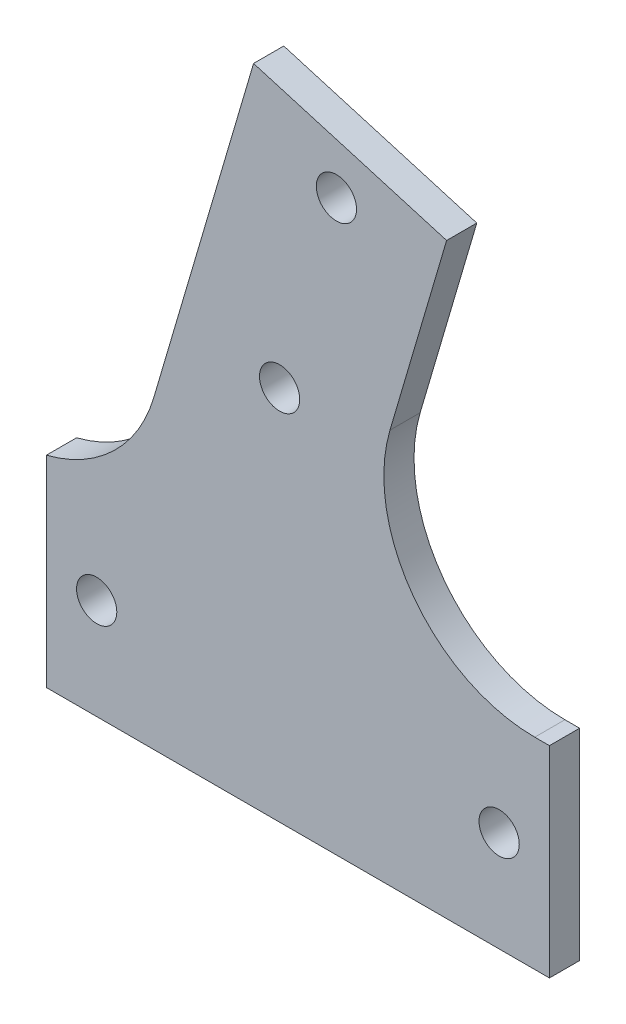
ISO-10303-21;
HEADER;
FILE_DESCRIPTION(('STEP AP214'),'2;1');
FILE_NAME('part.step','',(''),(''),'','','');
FILE_SCHEMA(('AUTOMOTIVE_DESIGN { 1 0 10303 214 1 1 1 1 }'));
ENDSEC;
DATA;
#1=APPLICATION_CONTEXT('core data for automotive mechanical design processes');
#2=APPLICATION_PROTOCOL_DEFINITION('international standard','automotive_design',2000,#1);
#3=PRODUCT_CONTEXT('',#1,'mechanical');
#4=PRODUCT('Part','Part','',(#3));
#5=PRODUCT_RELATED_PRODUCT_CATEGORY('part','',(#4));
#6=PRODUCT_DEFINITION_FORMATION('','',#4);
#7=PRODUCT_DEFINITION_CONTEXT('part definition',#1,'design');
#8=PRODUCT_DEFINITION('design','',#6,#7);
#9=PRODUCT_DEFINITION_SHAPE('','',#8);
#10=(LENGTH_UNIT() NAMED_UNIT(*) SI_UNIT(.MILLI.,.METRE.));
#11=(NAMED_UNIT(*) PLANE_ANGLE_UNIT() SI_UNIT($,.RADIAN.));
#12=(NAMED_UNIT(*) SI_UNIT($,.STERADIAN.) SOLID_ANGLE_UNIT());
#13=UNCERTAINTY_MEASURE_WITH_UNIT(LENGTH_MEASURE(1.E-05),#10,'distance_accuracy_value','');
#14=(GEOMETRIC_REPRESENTATION_CONTEXT(3) GLOBAL_UNCERTAINTY_ASSIGNED_CONTEXT((#13)) GLOBAL_UNIT_ASSIGNED_CONTEXT((#10,
#11,#12)) REPRESENTATION_CONTEXT('',''));
#15=CARTESIAN_POINT('',(0.,0.,0.));
#16=DIRECTION('',(0.,0.,1.));
#17=DIRECTION('',(1.,0.,0.));
#18=AXIS2_PLACEMENT_3D('',#15,#16,#17);
#19=CARTESIAN_POINT('',(-25.,10.,3.));
#20=DIRECTION('',(0.,-1.,0.));
#21=DIRECTION('',(1.,0.,0.));
#22=AXIS2_PLACEMENT_3D('',#19,#20,#21);
#23=PLANE('',#22);
#24=DIRECTION('',(-1.,0.,0.));
#25=VECTOR('',#24,1.);
#26=CARTESIAN_POINT('',(-25.,10.,0.));
#27=LINE('',#26,#25);
#28=CARTESIAN_POINT('',(25.,10.,0.));
#29=VERTEX_POINT('',#28);
#30=CARTESIAN_POINT('',(23.5412694196144,10.,0.));
#31=VERTEX_POINT('',#30);
#32=EDGE_CURVE('E172',#29,#31,#27,.T.);
#33=ORIENTED_EDGE('',*,*,#32,.T.);
#34=DIRECTION('',(0.,0.,-1.));
#35=VECTOR('',#34,1.);
#36=CARTESIAN_POINT('',(23.5412694196144,10.,3.));
#37=LINE('',#36,#35);
#38=CARTESIAN_POINT('',(23.5412694196144,10.,3.));
#39=VERTEX_POINT('',#38);
#40=EDGE_CURVE('E62',#31,#39,#37,.F.);
#41=ORIENTED_EDGE('',*,*,#40,.T.);
#42=DIRECTION('',(-1.,0.,0.));
#43=VECTOR('',#42,1.);
#44=CARTESIAN_POINT('',(-25.,10.,3.));
#45=LINE('',#44,#43);
#46=CARTESIAN_POINT('',(25.,10.,3.));
#47=VERTEX_POINT('',#46);
#48=EDGE_CURVE('E162',#47,#39,#45,.T.);
#49=ORIENTED_EDGE('',*,*,#48,.F.);
#50=DIRECTION('',(0.,0.,-1.));
#51=VECTOR('',#50,1.);
#52=CARTESIAN_POINT('',(25.,10.,3.));
#53=LINE('',#52,#51);
#54=EDGE_CURVE('E185',#47,#29,#53,.T.);
#55=ORIENTED_EDGE('',*,*,#54,.T.);
#56=EDGE_LOOP('',(#33,#41,#49,#55));
#57=FACE_BOUND('',#56,.T.);
#58=ADVANCED_FACE('F41',(#57),#23,.F.);
#59=CARTESIAN_POINT('',(0.,0.,3.));
#60=DIRECTION('',(0.,0.,1.));
#61=DIRECTION('',(1.,0.,0.));
#62=AXIS2_PLACEMENT_3D('',#59,#60,#61);
#63=PLANE('',#62);
#64=CARTESIAN_POINT('',(20.,0.,3.));
#65=DIRECTION('',(0.,0.,1.));
#66=DIRECTION('',(1.,0.,0.));
#67=AXIS2_PLACEMENT_3D('',#64,#65,#66);
#68=CIRCLE('',#67,2.);
#69=CARTESIAN_POINT('',(22.,0.,3.));
#70=VERTEX_POINT('',#69);
#71=EDGE_CURVE('E154',#70,#70,#68,.T.);
#72=ORIENTED_EDGE('',*,*,#71,.F.);
#73=EDGE_LOOP('',(#72));
#74=FACE_BOUND('',#73,.T.);
#75=DIRECTION('',(0.,1.,0.));
#76=VECTOR('',#75,1.);
#77=CARTESIAN_POINT('',(25.,10.,3.));
#78=LINE('',#77,#76);
#79=CARTESIAN_POINT('',(25.,-10.,3.));
#80=VERTEX_POINT('',#79);
#81=EDGE_CURVE('E160',#80,#47,#78,.T.);
#82=ORIENTED_EDGE('',*,*,#81,.T.);
#83=ORIENTED_EDGE('',*,*,#48,.T.);
#84=CARTESIAN_POINT('',(23.5412694196144,25.,3.));
#85=DIRECTION('',(0.,0.,1.));
#86=DIRECTION('',(1.,0.,0.));
#87=AXIS2_PLACEMENT_3D('',#84,#85,#86);
#88=CIRCLE('',#87,15.);
#89=CARTESIAN_POINT('',(9.15078689604537,29.2324948598732,3.));
#90=VERTEX_POINT('',#89);
#91=EDGE_CURVE('E11',#39,#90,#88,.F.);
#92=ORIENTED_EDGE('',*,*,#91,.T.);
#93=DIRECTION('',(-0.282166323991548,-0.959365501571271,0.));
#94=VECTOR('',#93,1.);
#95=CARTESIAN_POINT('',(3.4941707607886,10.,3.));
#96=LINE('',#95,#94);
#97=CARTESIAN_POINT('',(14.7808237204505,48.3746200628509,3.));
#98=VERTEX_POINT('',#97);
#99=EDGE_CURVE('E131',#98,#90,#96,.T.);
#100=ORIENTED_EDGE('',*,*,#99,.F.);
#101=DIRECTION('',(0.959365501571271,-0.282166323991548,0.));
#102=VECTOR('',#101,1.);
#103=CARTESIAN_POINT('',(14.7808237204505,48.3746200628509,3.));
#104=LINE('',#103,#102);
#105=CARTESIAN_POINT('',(-4.40648631097492,54.0179465426818,3.));
#106=VERTEX_POINT('',#105);
#107=EDGE_CURVE('E121',#106,#98,#104,.T.);
#108=ORIENTED_EDGE('',*,*,#107,.F.);
#109=DIRECTION('',(0.282166323991548,0.959365501571271,0.));
#110=VECTOR('',#109,1.);
#111=CARTESIAN_POINT('',(-17.3529411764694,10.,3.));
#112=LINE('',#111,#110);
#113=CARTESIAN_POINT('',(-14.3233903611,20.3004727722562,3.));
#114=VERTEX_POINT('',#113);
#115=EDGE_CURVE('E110',#114,#106,#112,.T.);
#116=ORIENTED_EDGE('',*,*,#115,.F.);
#117=CARTESIAN_POINT('',(-28.7138728846691,24.5329676321294,3.));
#118=DIRECTION('',(0.,0.,1.));
#119=DIRECTION('',(1.,0.,0.));
#120=AXIS2_PLACEMENT_3D('',#117,#118,#119);
#121=CIRCLE('',#120,15.);
#122=CARTESIAN_POINT('',(-25.,10.,3.));
#123=VERTEX_POINT('',#122);
#124=EDGE_CURVE('E195',#114,#123,#121,.F.);
#125=ORIENTED_EDGE('',*,*,#124,.T.);
#126=DIRECTION('',(0.,-1.,0.));
#127=VECTOR('',#126,1.);
#128=CARTESIAN_POINT('',(-25.,10.,3.));
#129=LINE('',#128,#127);
#130=CARTESIAN_POINT('',(-25.,-10.,3.));
#131=VERTEX_POINT('',#130);
#132=EDGE_CURVE('E165',#123,#131,#129,.T.);
#133=ORIENTED_EDGE('',*,*,#132,.T.);
#134=DIRECTION('',(1.,0.,0.));
#135=VECTOR('',#134,1.);
#136=CARTESIAN_POINT('',(-25.,-10.,3.));
#137=LINE('',#136,#135);
#138=EDGE_CURVE('E167',#131,#80,#137,.T.);
#139=ORIENTED_EDGE('',*,*,#138,.T.);
#140=EDGE_LOOP('',(#82,#83,#92,#100,#108,#116,#125,#133,#139));
#141=FACE_BOUND('',#140,.T.);
#142=CARTESIAN_POINT('',(-20.,0.,3.));
#143=DIRECTION('',(0.,0.,1.));
#144=DIRECTION('',(1.,0.,0.));
#145=AXIS2_PLACEMENT_3D('',#142,#143,#144);
#146=CIRCLE('',#145,2.);
#147=CARTESIAN_POINT('',(-18.,0.,3.));
#148=VERTEX_POINT('',#147);
#149=EDGE_CURVE('E148',#148,#148,#146,.T.);
#150=ORIENTED_EDGE('',*,*,#149,.F.);
#151=EDGE_LOOP('',(#150));
#152=FACE_BOUND('',#151,.T.);
#153=CARTESIAN_POINT('',(-1.81685813250088,27.3825920561546,3.));
#154=DIRECTION('',(0.,0.,-1.));
#155=DIRECTION('',(-1.,0.,0.));
#156=AXIS2_PLACEMENT_3D('',#153,#154,#155);
#157=CIRCLE('',#156,2.);
#158=CARTESIAN_POINT('',(-3.81685813250087,27.3825920561546,3.));
#159=VERTEX_POINT('',#158);
#160=EDGE_CURVE('E263',#159,#159,#157,.T.);
#161=ORIENTED_EDGE('',*,*,#160,.T.);
#162=EDGE_LOOP('',(#161));
#163=FACE_BOUND('',#162,.T.);
#164=CARTESIAN_POINT('',(3.82646834733007,46.56990208758,3.));
#165=DIRECTION('',(0.,0.,-1.));
#166=DIRECTION('',(-1.,0.,0.));
#167=AXIS2_PLACEMENT_3D('',#164,#165,#166);
#168=CIRCLE('',#167,2.);
#169=CARTESIAN_POINT('',(1.82646834733007,46.56990208758,3.));
#170=VERTEX_POINT('',#169);
#171=EDGE_CURVE('E143',#170,#170,#168,.T.);
#172=ORIENTED_EDGE('',*,*,#171,.T.);
#173=EDGE_LOOP('',(#172));
#174=FACE_BOUND('',#173,.T.);
#175=ADVANCED_FACE('F134',(#74,#141,#152,#163,#174),#63,.T.);
#176=CARTESIAN_POINT('',(0.,0.,0.));
#177=DIRECTION('',(0.,0.,1.));
#178=DIRECTION('',(1.,0.,0.));
#179=AXIS2_PLACEMENT_3D('',#176,#177,#178);
#180=PLANE('',#179);
#181=DIRECTION('',(0.,1.,0.));
#182=VECTOR('',#181,1.);
#183=CARTESIAN_POINT('',(25.,10.,0.));
#184=LINE('',#183,#182);
#185=CARTESIAN_POINT('',(25.,-10.,0.));
#186=VERTEX_POINT('',#185);
#187=EDGE_CURVE('E157',#186,#29,#184,.T.);
#188=ORIENTED_EDGE('',*,*,#187,.F.);
#189=DIRECTION('',(1.,0.,0.));
#190=VECTOR('',#189,1.);
#191=CARTESIAN_POINT('',(-25.,-10.,0.));
#192=LINE('',#191,#190);
#193=CARTESIAN_POINT('',(-25.,-10.,0.));
#194=VERTEX_POINT('',#193);
#195=EDGE_CURVE('E163',#194,#186,#192,.T.);
#196=ORIENTED_EDGE('',*,*,#195,.F.);
#197=DIRECTION('',(0.,-1.,0.));
#198=VECTOR('',#197,1.);
#199=CARTESIAN_POINT('',(-25.,10.,0.));
#200=LINE('',#199,#198);
#201=CARTESIAN_POINT('',(-25.,10.,0.));
#202=VERTEX_POINT('',#201);
#203=EDGE_CURVE('E174',#202,#194,#200,.T.);
#204=ORIENTED_EDGE('',*,*,#203,.F.);
#205=CARTESIAN_POINT('',(-28.7138728846691,24.5329676321294,0.));
#206=DIRECTION('',(0.,0.,1.));
#207=DIRECTION('',(1.,0.,0.));
#208=AXIS2_PLACEMENT_3D('',#205,#206,#207);
#209=CIRCLE('',#208,15.);
#210=CARTESIAN_POINT('',(-14.3233903611,20.3004727722562,0.));
#211=VERTEX_POINT('',#210);
#212=EDGE_CURVE('E193',#202,#211,#209,.T.);
#213=ORIENTED_EDGE('',*,*,#212,.T.);
#214=DIRECTION('',(0.282166323991548,0.959365501571271,0.));
#215=VECTOR('',#214,1.);
#216=CARTESIAN_POINT('',(-17.3529411764694,10.,0.));
#217=LINE('',#216,#215);
#218=CARTESIAN_POINT('',(-4.40648631097492,54.0179465426818,0.));
#219=VERTEX_POINT('',#218);
#220=EDGE_CURVE('E141',#211,#219,#217,.T.);
#221=ORIENTED_EDGE('',*,*,#220,.T.);
#222=DIRECTION('',(0.959365501571271,-0.282166323991548,0.));
#223=VECTOR('',#222,1.);
#224=CARTESIAN_POINT('',(14.7808237204505,48.3746200628509,0.));
#225=LINE('',#224,#223);
#226=CARTESIAN_POINT('',(14.7808237204505,48.3746200628509,0.));
#227=VERTEX_POINT('',#226);
#228=EDGE_CURVE('E129',#219,#227,#225,.T.);
#229=ORIENTED_EDGE('',*,*,#228,.T.);
#230=DIRECTION('',(-0.282166323991548,-0.959365501571271,0.));
#231=VECTOR('',#230,1.);
#232=CARTESIAN_POINT('',(3.4941707607886,10.,0.));
#233=LINE('',#232,#231);
#234=CARTESIAN_POINT('',(9.15078689604537,29.2324948598732,0.));
#235=VERTEX_POINT('',#234);
#236=EDGE_CURVE('E122',#227,#235,#233,.T.);
#237=ORIENTED_EDGE('',*,*,#236,.T.);
#238=CARTESIAN_POINT('',(23.5412694196144,25.,0.));
#239=DIRECTION('',(0.,0.,1.));
#240=DIRECTION('',(1.,0.,0.));
#241=AXIS2_PLACEMENT_3D('',#238,#239,#240);
#242=CIRCLE('',#241,15.);
#243=EDGE_CURVE('E49',#235,#31,#242,.T.);
#244=ORIENTED_EDGE('',*,*,#243,.T.);
#245=ORIENTED_EDGE('',*,*,#32,.F.);
#246=EDGE_LOOP('',(#188,#196,#204,#213,#221,#229,#237,#244,#245));
#247=FACE_BOUND('',#246,.T.);
#248=CARTESIAN_POINT('',(20.,0.,0.));
#249=DIRECTION('',(0.,0.,1.));
#250=DIRECTION('',(1.,0.,0.));
#251=AXIS2_PLACEMENT_3D('',#248,#249,#250);
#252=CIRCLE('',#251,2.);
#253=CARTESIAN_POINT('',(22.,0.,0.));
#254=VERTEX_POINT('',#253);
#255=EDGE_CURVE('E151',#254,#254,#252,.T.);
#256=ORIENTED_EDGE('',*,*,#255,.T.);
#257=EDGE_LOOP('',(#256));
#258=FACE_BOUND('',#257,.T.);
#259=CARTESIAN_POINT('',(-20.,0.,0.));
#260=DIRECTION('',(0.,0.,1.));
#261=DIRECTION('',(1.,0.,0.));
#262=AXIS2_PLACEMENT_3D('',#259,#260,#261);
#263=CIRCLE('',#262,2.);
#264=CARTESIAN_POINT('',(-18.,0.,0.));
#265=VERTEX_POINT('',#264);
#266=EDGE_CURVE('E146',#265,#265,#263,.T.);
#267=ORIENTED_EDGE('',*,*,#266,.T.);
#268=EDGE_LOOP('',(#267));
#269=FACE_BOUND('',#268,.T.);
#270=CARTESIAN_POINT('',(-1.81685813250088,27.3825920561546,0.));
#271=DIRECTION('',(0.,0.,-1.));
#272=DIRECTION('',(-1.,0.,0.));
#273=AXIS2_PLACEMENT_3D('',#270,#271,#272);
#274=CIRCLE('',#273,2.);
#275=CARTESIAN_POINT('',(-3.81685813250087,27.3825920561546,0.));
#276=VERTEX_POINT('',#275);
#277=EDGE_CURVE('E266',#276,#276,#274,.T.);
#278=ORIENTED_EDGE('',*,*,#277,.F.);
#279=EDGE_LOOP('',(#278));
#280=FACE_BOUND('',#279,.T.);
#281=CARTESIAN_POINT('',(3.82646834733007,46.56990208758,0.));
#282=DIRECTION('',(0.,0.,-1.));
#283=DIRECTION('',(-1.,0.,0.));
#284=AXIS2_PLACEMENT_3D('',#281,#282,#283);
#285=CIRCLE('',#284,2.);
#286=CARTESIAN_POINT('',(1.82646834733007,46.56990208758,0.));
#287=VERTEX_POINT('',#286);
#288=EDGE_CURVE('E269',#287,#287,#285,.T.);
#289=ORIENTED_EDGE('',*,*,#288,.F.);
#290=EDGE_LOOP('',(#289));
#291=FACE_BOUND('',#290,.T.);
#292=ADVANCED_FACE('F206',(#247,#258,#269,#280,#291),#180,.F.);
#293=CARTESIAN_POINT('',(25.,10.,3.));
#294=DIRECTION('',(-1.,0.,0.));
#295=DIRECTION('',(0.,0.,1.));
#296=AXIS2_PLACEMENT_3D('',#293,#294,#295);
#297=PLANE('',#296);
#298=ORIENTED_EDGE('',*,*,#187,.T.);
#299=ORIENTED_EDGE('',*,*,#54,.F.);
#300=ORIENTED_EDGE('',*,*,#81,.F.);
#301=DIRECTION('',(0.,0.,-1.));
#302=VECTOR('',#301,1.);
#303=CARTESIAN_POINT('',(25.,-10.,3.));
#304=LINE('',#303,#302);
#305=EDGE_CURVE('E169',#80,#186,#304,.T.);
#306=ORIENTED_EDGE('',*,*,#305,.T.);
#307=EDGE_LOOP('',(#298,#299,#300,#306));
#308=FACE_BOUND('',#307,.T.);
#309=ADVANCED_FACE('F216',(#308),#297,.F.);
#310=CARTESIAN_POINT('',(-25.,10.,3.));
#311=DIRECTION('',(1.,0.,0.));
#312=DIRECTION('',(0.,1.,0.));
#313=AXIS2_PLACEMENT_3D('',#310,#311,#312);
#314=PLANE('',#313);
#315=ORIENTED_EDGE('',*,*,#203,.T.);
#316=DIRECTION('',(0.,0.,-1.));
#317=VECTOR('',#316,1.);
#318=CARTESIAN_POINT('',(-25.,-10.,3.));
#319=LINE('',#318,#317);
#320=EDGE_CURVE('E179',#131,#194,#319,.T.);
#321=ORIENTED_EDGE('',*,*,#320,.F.);
#322=ORIENTED_EDGE('',*,*,#132,.F.);
#323=DIRECTION('',(0.,0.,-1.));
#324=VECTOR('',#323,1.);
#325=CARTESIAN_POINT('',(-25.,10.,3.));
#326=LINE('',#325,#324);
#327=EDGE_CURVE('E182',#123,#202,#326,.T.);
#328=ORIENTED_EDGE('',*,*,#327,.T.);
#329=EDGE_LOOP('',(#315,#321,#322,#328));
#330=FACE_BOUND('',#329,.T.);
#331=ADVANCED_FACE('F201',(#330),#314,.F.);
#332=CARTESIAN_POINT('',(-25.,-10.,3.));
#333=DIRECTION('',(0.,1.,0.));
#334=DIRECTION('',(-1.,0.,0.));
#335=AXIS2_PLACEMENT_3D('',#332,#333,#334);
#336=PLANE('',#335);
#337=ORIENTED_EDGE('',*,*,#195,.T.);
#338=ORIENTED_EDGE('',*,*,#305,.F.);
#339=ORIENTED_EDGE('',*,*,#138,.F.);
#340=ORIENTED_EDGE('',*,*,#320,.T.);
#341=EDGE_LOOP('',(#337,#338,#339,#340));
#342=FACE_BOUND('',#341,.T.);
#343=ADVANCED_FACE('F210',(#342),#336,.F.);
#344=CARTESIAN_POINT('',(20.,0.,3.));
#345=DIRECTION('',(0.,0.,-1.));
#346=DIRECTION('',(-1.,0.,0.));
#347=AXIS2_PLACEMENT_3D('',#344,#345,#346);
#348=CYLINDRICAL_SURFACE('',#347,2.);
#349=ORIENTED_EDGE('',*,*,#71,.T.);
#350=EDGE_LOOP('',(#349));
#351=FACE_BOUND('',#350,.T.);
#352=ORIENTED_EDGE('',*,*,#255,.F.);
#353=EDGE_LOOP('',(#352));
#354=FACE_BOUND('',#353,.T.);
#355=ADVANCED_FACE('F231',(#351,#354),#348,.F.);
#356=CARTESIAN_POINT('',(-20.,0.,3.));
#357=DIRECTION('',(0.,0.,-1.));
#358=DIRECTION('',(-1.,0.,0.));
#359=AXIS2_PLACEMENT_3D('',#356,#357,#358);
#360=CYLINDRICAL_SURFACE('',#359,2.);
#361=ORIENTED_EDGE('',*,*,#149,.T.);
#362=EDGE_LOOP('',(#361));
#363=FACE_BOUND('',#362,.T.);
#364=ORIENTED_EDGE('',*,*,#266,.F.);
#365=EDGE_LOOP('',(#364));
#366=FACE_BOUND('',#365,.T.);
#367=ADVANCED_FACE('F223',(#363,#366),#360,.F.);
#368=CARTESIAN_POINT('',(3.4941707607886,10.,3.));
#369=DIRECTION('',(0.959365501571271,-0.282166323991548,0.));
#370=DIRECTION('',(0.282166323991548,0.959365501571271,0.));
#371=AXIS2_PLACEMENT_3D('',#368,#369,#370);
#372=PLANE('',#371);
#373=ORIENTED_EDGE('',*,*,#99,.T.);
#374=DIRECTION('',(0.,0.,-1.));
#375=VECTOR('',#374,1.);
#376=CARTESIAN_POINT('',(9.15078689604537,29.2324948598732,3.));
#377=LINE('',#376,#375);
#378=EDGE_CURVE('E189',#90,#235,#377,.T.);
#379=ORIENTED_EDGE('',*,*,#378,.T.);
#380=ORIENTED_EDGE('',*,*,#236,.F.);
#381=DIRECTION('',(0.,0.,-1.));
#382=VECTOR('',#381,1.);
#383=CARTESIAN_POINT('',(14.7808237204505,48.3746200628509,3.));
#384=LINE('',#383,#382);
#385=EDGE_CURVE('E130',#98,#227,#384,.T.);
#386=ORIENTED_EDGE('',*,*,#385,.F.);
#387=EDGE_LOOP('',(#373,#379,#380,#386));
#388=FACE_BOUND('',#387,.T.);
#389=ADVANCED_FACE('F220',(#388),#372,.T.);
#390=CARTESIAN_POINT('',(14.7808237204505,48.3746200628509,3.));
#391=DIRECTION('',(0.282166323991548,0.959365501571271,0.));
#392=DIRECTION('',(-0.959365501571271,0.282166323991548,0.));
#393=AXIS2_PLACEMENT_3D('',#390,#391,#392);
#394=PLANE('',#393);
#395=ORIENTED_EDGE('',*,*,#228,.F.);
#396=DIRECTION('',(0.,0.,-1.));
#397=VECTOR('',#396,1.);
#398=CARTESIAN_POINT('',(-4.40648631097492,54.0179465426818,3.));
#399=LINE('',#398,#397);
#400=EDGE_CURVE('E114',#106,#219,#399,.T.);
#401=ORIENTED_EDGE('',*,*,#400,.F.);
#402=ORIENTED_EDGE('',*,*,#107,.T.);
#403=ORIENTED_EDGE('',*,*,#385,.T.);
#404=EDGE_LOOP('',(#395,#401,#402,#403));
#405=FACE_BOUND('',#404,.T.);
#406=ADVANCED_FACE('F126',(#405),#394,.T.);
#407=CARTESIAN_POINT('',(-17.3529411764694,10.,3.));
#408=DIRECTION('',(-0.959365501571271,0.282166323991548,0.));
#409=DIRECTION('',(-0.282166323991548,-0.959365501571271,0.));
#410=AXIS2_PLACEMENT_3D('',#407,#408,#409);
#411=PLANE('',#410);
#412=ORIENTED_EDGE('',*,*,#220,.F.);
#413=DIRECTION('',(0.,0.,-1.));
#414=VECTOR('',#413,1.);
#415=CARTESIAN_POINT('',(-14.3233903611,20.3004727722562,3.));
#416=LINE('',#415,#414);
#417=EDGE_CURVE('E117',#211,#114,#416,.F.);
#418=ORIENTED_EDGE('',*,*,#417,.T.);
#419=ORIENTED_EDGE('',*,*,#115,.T.);
#420=ORIENTED_EDGE('',*,*,#400,.T.);
#421=EDGE_LOOP('',(#412,#418,#419,#420));
#422=FACE_BOUND('',#421,.T.);
#423=ADVANCED_FACE('F113',(#422),#411,.T.);
#424=CARTESIAN_POINT('',(3.82646834733007,46.56990208758,3.));
#425=DIRECTION('',(0.,0.,-1.));
#426=DIRECTION('',(-1.,0.,0.));
#427=AXIS2_PLACEMENT_3D('',#424,#425,#426);
#428=CYLINDRICAL_SURFACE('',#427,2.);
#429=ORIENTED_EDGE('',*,*,#171,.F.);
#430=EDGE_LOOP('',(#429));
#431=FACE_BOUND('',#430,.T.);
#432=ORIENTED_EDGE('',*,*,#288,.T.);
#433=EDGE_LOOP('',(#432));
#434=FACE_BOUND('',#433,.T.);
#435=ADVANCED_FACE('F254',(#431,#434),#428,.F.);
#436=CARTESIAN_POINT('',(-1.81685813250088,27.3825920561546,3.));
#437=DIRECTION('',(0.,0.,-1.));
#438=DIRECTION('',(-1.,0.,0.));
#439=AXIS2_PLACEMENT_3D('',#436,#437,#438);
#440=CYLINDRICAL_SURFACE('',#439,2.);
#441=ORIENTED_EDGE('',*,*,#160,.F.);
#442=EDGE_LOOP('',(#441));
#443=FACE_BOUND('',#442,.T.);
#444=ORIENTED_EDGE('',*,*,#277,.T.);
#445=EDGE_LOOP('',(#444));
#446=FACE_BOUND('',#445,.T.);
#447=ADVANCED_FACE('F249',(#443,#446),#440,.F.);
#448=CARTESIAN_POINT('',(-28.7138728846691,24.5329676321294,3.));
#449=DIRECTION('',(0.,0.,1.));
#450=DIRECTION('',(1.,0.,0.));
#451=AXIS2_PLACEMENT_3D('',#448,#449,#450);
#452=CYLINDRICAL_SURFACE('',#451,15.);
#453=ORIENTED_EDGE('',*,*,#124,.F.);
#454=ORIENTED_EDGE('',*,*,#417,.F.);
#455=ORIENTED_EDGE('',*,*,#212,.F.);
#456=ORIENTED_EDGE('',*,*,#327,.F.);
#457=EDGE_LOOP('',(#453,#454,#455,#456));
#458=FACE_BOUND('',#457,.T.);
#459=ADVANCED_FACE('F204',(#458),#452,.F.);
#460=CARTESIAN_POINT('',(23.5412694196144,25.,3.));
#461=DIRECTION('',(0.,0.,-1.));
#462=DIRECTION('',(-1.,0.,0.));
#463=AXIS2_PLACEMENT_3D('',#460,#461,#462);
#464=CYLINDRICAL_SURFACE('',#463,15.);
#465=ORIENTED_EDGE('',*,*,#91,.F.);
#466=ORIENTED_EDGE('',*,*,#40,.F.);
#467=ORIENTED_EDGE('',*,*,#243,.F.);
#468=ORIENTED_EDGE('',*,*,#378,.F.);
#469=EDGE_LOOP('',(#465,#466,#467,#468));
#470=FACE_BOUND('',#469,.T.);
#471=ADVANCED_FACE('F43',(#470),#464,.F.);
#472=CLOSED_SHELL('',(#58,#175,#292,#309,#331,#343,#355,#367,#389,#406,#423,#435,#447,#459,#471));
#473=MANIFOLD_SOLID_BREP('B2',#472);
#474=ADVANCED_BREP_SHAPE_REPRESENTATION('',(#18,#473),#14);
#475=SHAPE_DEFINITION_REPRESENTATION(#9,#474);
ENDSEC;
END-ISO-10303-21;
